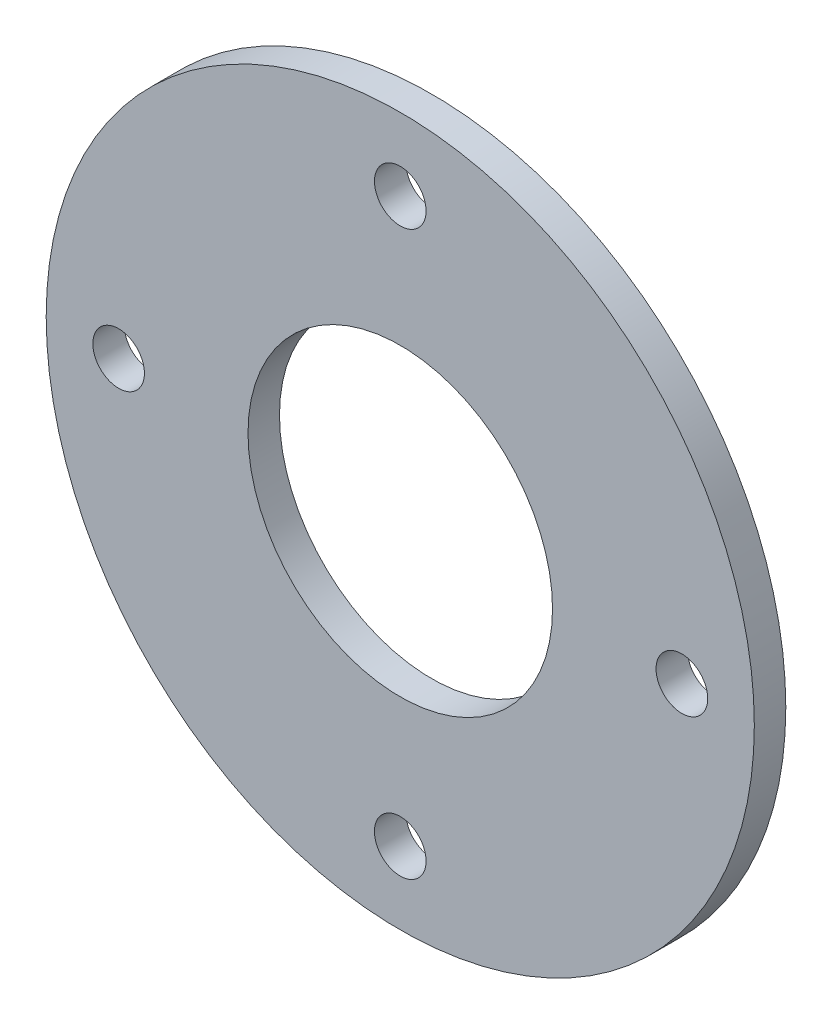
ISO-10303-21;
HEADER;
FILE_DESCRIPTION(('STEP AP214'),'2;1');
FILE_NAME('part.step','',(''),(''),'','','');
FILE_SCHEMA(('AUTOMOTIVE_DESIGN { 1 0 10303 214 1 1 1 1 }'));
ENDSEC;
DATA;
#1=APPLICATION_CONTEXT('core data for automotive mechanical design processes');
#2=APPLICATION_PROTOCOL_DEFINITION('international standard','automotive_design',2000,#1);
#3=PRODUCT_CONTEXT('',#1,'mechanical');
#4=PRODUCT('Part','Part','',(#3));
#5=PRODUCT_RELATED_PRODUCT_CATEGORY('part','',(#4));
#6=PRODUCT_DEFINITION_FORMATION('','',#4);
#7=PRODUCT_DEFINITION_CONTEXT('part definition',#1,'design');
#8=PRODUCT_DEFINITION('design','',#6,#7);
#9=PRODUCT_DEFINITION_SHAPE('','',#8);
#10=(LENGTH_UNIT() NAMED_UNIT(*) SI_UNIT(.MILLI.,.METRE.));
#11=(NAMED_UNIT(*) PLANE_ANGLE_UNIT() SI_UNIT($,.RADIAN.));
#12=(NAMED_UNIT(*) SI_UNIT($,.STERADIAN.) SOLID_ANGLE_UNIT());
#13=UNCERTAINTY_MEASURE_WITH_UNIT(LENGTH_MEASURE(1.E-05),#10,'distance_accuracy_value','');
#14=(GEOMETRIC_REPRESENTATION_CONTEXT(3) GLOBAL_UNCERTAINTY_ASSIGNED_CONTEXT((#13)) GLOBAL_UNIT_ASSIGNED_CONTEXT((#10,
#11,#12)) REPRESENTATION_CONTEXT('',''));
#15=CARTESIAN_POINT('',(0.,0.,0.));
#16=DIRECTION('',(0.,0.,1.));
#17=DIRECTION('',(1.,0.,0.));
#18=AXIS2_PLACEMENT_3D('',#15,#16,#17);
#19=CARTESIAN_POINT('',(0.,0.,0.));
#20=DIRECTION('',(0.,0.,1.));
#21=DIRECTION('',(1.,0.,0.));
#22=AXIS2_PLACEMENT_3D('',#19,#20,#21);
#23=PLANE('',#22);
#24=CARTESIAN_POINT('',(-90.9113801471292,0.,0.));
#25=DIRECTION('',(0.,0.,-1.));
#26=DIRECTION('',(-1.,0.,0.));
#27=AXIS2_PLACEMENT_3D('',#24,#25,#26);
#28=CIRCLE('',#27,8.33373999999999);
#29=CARTESIAN_POINT('',(-99.2451201471292,0.,0.));
#30=VERTEX_POINT('',#29);
#31=EDGE_CURVE('E67',#30,#30,#28,.T.);
#32=ORIENTED_EDGE('',*,*,#31,.F.);
#33=EDGE_LOOP('',(#32));
#34=FACE_BOUND('',#33,.T.);
#35=CARTESIAN_POINT('',(0.,-90.9113801471292,0.));
#36=DIRECTION('',(0.,0.,-1.));
#37=DIRECTION('',(-1.,0.,0.));
#38=AXIS2_PLACEMENT_3D('',#35,#36,#37);
#39=CIRCLE('',#38,8.33373999999999);
#40=CARTESIAN_POINT('',(-8.33373999999999,-90.9113801471292,0.));
#41=VERTEX_POINT('',#40);
#42=EDGE_CURVE('E61',#41,#41,#39,.T.);
#43=ORIENTED_EDGE('',*,*,#42,.F.);
#44=EDGE_LOOP('',(#43));
#45=FACE_BOUND('',#44,.T.);
#46=CARTESIAN_POINT('',(90.9113801471292,0.,0.));
#47=DIRECTION('',(0.,0.,-1.));
#48=DIRECTION('',(-1.,0.,0.));
#49=AXIS2_PLACEMENT_3D('',#46,#47,#48);
#50=CIRCLE('',#49,8.33373999999999);
#51=CARTESIAN_POINT('',(82.5776401471292,0.,0.));
#52=VERTEX_POINT('',#51);
#53=EDGE_CURVE('E53',#52,#52,#50,.T.);
#54=ORIENTED_EDGE('',*,*,#53,.F.);
#55=EDGE_LOOP('',(#54));
#56=FACE_BOUND('',#55,.T.);
#57=CARTESIAN_POINT('',(0.,0.,0.));
#58=DIRECTION('',(0.,0.,1.));
#59=DIRECTION('',(1.,0.,0.));
#60=AXIS2_PLACEMENT_3D('',#57,#58,#59);
#61=CIRCLE('',#60,114.3);
#62=CARTESIAN_POINT('',(114.3,0.,0.));
#63=VERTEX_POINT('',#62);
#64=EDGE_CURVE('E41',#63,#63,#61,.T.);
#65=ORIENTED_EDGE('',*,*,#64,.F.);
#66=EDGE_LOOP('',(#65));
#67=FACE_BOUND('',#66,.T.);
#68=CARTESIAN_POINT('',(0.,0.,0.));
#69=DIRECTION('',(0.,0.,1.));
#70=DIRECTION('',(1.,0.,0.));
#71=AXIS2_PLACEMENT_3D('',#68,#69,#70);
#72=CIRCLE('',#71,49.1499994635115);
#73=CARTESIAN_POINT('',(49.1499994635115,0.,0.));
#74=VERTEX_POINT('',#73);
#75=EDGE_CURVE('E50',#74,#74,#72,.T.);
#76=ORIENTED_EDGE('',*,*,#75,.T.);
#77=EDGE_LOOP('',(#76));
#78=FACE_BOUND('',#77,.T.);
#79=CARTESIAN_POINT('',(0.,90.8527596999048,0.));
#80=DIRECTION('',(0.,0.,-1.));
#81=DIRECTION('',(-1.,0.,0.));
#82=AXIS2_PLACEMENT_3D('',#79,#80,#81);
#83=CIRCLE('',#82,8.33373999999999);
#84=CARTESIAN_POINT('',(-8.33373999999999,90.8527596999048,0.));
#85=VERTEX_POINT('',#84);
#86=EDGE_CURVE('E73',#85,#85,#83,.T.);
#87=ORIENTED_EDGE('',*,*,#86,.F.);
#88=EDGE_LOOP('',(#87));
#89=FACE_BOUND('',#88,.T.);
#90=ADVANCED_FACE('F37',(#34,#45,#56,#67,#78,#89),#23,.F.);
#91=CARTESIAN_POINT('',(0.,0.,10.16));
#92=DIRECTION('',(0.,0.,1.));
#93=DIRECTION('',(1.,0.,0.));
#94=AXIS2_PLACEMENT_3D('',#91,#92,#93);
#95=PLANE('',#94);
#96=CARTESIAN_POINT('',(0.,90.8527596999048,10.16));
#97=DIRECTION('',(0.,0.,-1.));
#98=DIRECTION('',(-1.,0.,0.));
#99=AXIS2_PLACEMENT_3D('',#96,#97,#98);
#100=CIRCLE('',#99,8.33373999999998);
#101=CARTESIAN_POINT('',(-8.33373999999998,90.8527596999048,10.16));
#102=VERTEX_POINT('',#101);
#103=EDGE_CURVE('E76',#102,#102,#100,.T.);
#104=ORIENTED_EDGE('',*,*,#103,.T.);
#105=EDGE_LOOP('',(#104));
#106=FACE_BOUND('',#105,.T.);
#107=CARTESIAN_POINT('',(-90.9113801471292,0.,10.16));
#108=DIRECTION('',(0.,0.,-1.));
#109=DIRECTION('',(-1.,0.,0.));
#110=AXIS2_PLACEMENT_3D('',#107,#108,#109);
#111=CIRCLE('',#110,8.33373999999999);
#112=CARTESIAN_POINT('',(-99.2451201471292,0.,10.16));
#113=VERTEX_POINT('',#112);
#114=EDGE_CURVE('E70',#113,#113,#111,.T.);
#115=ORIENTED_EDGE('',*,*,#114,.T.);
#116=EDGE_LOOP('',(#115));
#117=FACE_BOUND('',#116,.T.);
#118=CARTESIAN_POINT('',(0.,-90.9113801471292,10.16));
#119=DIRECTION('',(0.,0.,-1.));
#120=DIRECTION('',(-1.,0.,0.));
#121=AXIS2_PLACEMENT_3D('',#118,#119,#120);
#122=CIRCLE('',#121,8.33373999999998);
#123=CARTESIAN_POINT('',(-8.33373999999998,-90.9113801471292,10.16));
#124=VERTEX_POINT('',#123);
#125=EDGE_CURVE('E64',#124,#124,#122,.T.);
#126=ORIENTED_EDGE('',*,*,#125,.T.);
#127=EDGE_LOOP('',(#126));
#128=FACE_BOUND('',#127,.T.);
#129=CARTESIAN_POINT('',(90.9113801471292,0.,10.16));
#130=DIRECTION('',(0.,0.,-1.));
#131=DIRECTION('',(-1.,0.,0.));
#132=AXIS2_PLACEMENT_3D('',#129,#130,#131);
#133=CIRCLE('',#132,8.33373999999998);
#134=CARTESIAN_POINT('',(82.5776401471292,0.,10.16));
#135=VERTEX_POINT('',#134);
#136=EDGE_CURVE('E58',#135,#135,#133,.T.);
#137=ORIENTED_EDGE('',*,*,#136,.T.);
#138=EDGE_LOOP('',(#137));
#139=FACE_BOUND('',#138,.T.);
#140=CARTESIAN_POINT('',(0.,0.,10.16));
#141=DIRECTION('',(0.,0.,1.));
#142=DIRECTION('',(1.,0.,0.));
#143=AXIS2_PLACEMENT_3D('',#140,#141,#142);
#144=CIRCLE('',#143,114.3);
#145=CARTESIAN_POINT('',(114.3,0.,10.16));
#146=VERTEX_POINT('',#145);
#147=EDGE_CURVE('E10',#146,#146,#144,.T.);
#148=ORIENTED_EDGE('',*,*,#147,.T.);
#149=EDGE_LOOP('',(#148));
#150=FACE_BOUND('',#149,.T.);
#151=CARTESIAN_POINT('',(0.,0.,10.16));
#152=DIRECTION('',(0.,0.,1.));
#153=DIRECTION('',(1.,0.,0.));
#154=AXIS2_PLACEMENT_3D('',#151,#152,#153);
#155=CIRCLE('',#154,49.1499994635115);
#156=CARTESIAN_POINT('',(49.1499994635115,0.,10.16));
#157=VERTEX_POINT('',#156);
#158=EDGE_CURVE('E48',#157,#157,#155,.T.);
#159=ORIENTED_EDGE('',*,*,#158,.F.);
#160=EDGE_LOOP('',(#159));
#161=FACE_BOUND('',#160,.T.);
#162=ADVANCED_FACE('F80',(#106,#117,#128,#139,#150,#161),#95,.T.);
#163=CARTESIAN_POINT('',(0.,0.,10.16));
#164=DIRECTION('',(0.,0.,-1.));
#165=DIRECTION('',(-1.,0.,0.));
#166=AXIS2_PLACEMENT_3D('',#163,#164,#165);
#167=CYLINDRICAL_SURFACE('',#166,114.3);
#168=ORIENTED_EDGE('',*,*,#147,.F.);
#169=EDGE_LOOP('',(#168));
#170=FACE_BOUND('',#169,.T.);
#171=ORIENTED_EDGE('',*,*,#64,.T.);
#172=EDGE_LOOP('',(#171));
#173=FACE_BOUND('',#172,.T.);
#174=ADVANCED_FACE('F39',(#170,#173),#167,.T.);
#175=CARTESIAN_POINT('',(0.,0.,10.16));
#176=DIRECTION('',(0.,0.,-1.));
#177=DIRECTION('',(-1.,0.,0.));
#178=AXIS2_PLACEMENT_3D('',#175,#176,#177);
#179=CYLINDRICAL_SURFACE('',#178,49.1499994635115);
#180=ORIENTED_EDGE('',*,*,#158,.T.);
#181=EDGE_LOOP('',(#180));
#182=FACE_BOUND('',#181,.T.);
#183=ORIENTED_EDGE('',*,*,#75,.F.);
#184=EDGE_LOOP('',(#183));
#185=FACE_BOUND('',#184,.T.);
#186=ADVANCED_FACE('F99',(#182,#185),#179,.F.);
#187=CARTESIAN_POINT('',(90.9113801471292,0.,0.));
#188=DIRECTION('',(0.,0.,-1.));
#189=DIRECTION('',(-1.,0.,0.));
#190=AXIS2_PLACEMENT_3D('',#187,#188,#189);
#191=CYLINDRICAL_SURFACE('',#190,8.33373999999998);
#192=ORIENTED_EDGE('',*,*,#136,.F.);
#193=EDGE_LOOP('',(#192));
#194=FACE_BOUND('',#193,.T.);
#195=ORIENTED_EDGE('',*,*,#53,.T.);
#196=EDGE_LOOP('',(#195));
#197=FACE_BOUND('',#196,.T.);
#198=ADVANCED_FACE('F102',(#194,#197),#191,.F.);
#199=CARTESIAN_POINT('',(0.,-90.9113801471292,0.));
#200=DIRECTION('',(0.,0.,-1.));
#201=DIRECTION('',(-1.,0.,0.));
#202=AXIS2_PLACEMENT_3D('',#199,#200,#201);
#203=CYLINDRICAL_SURFACE('',#202,8.33373999999998);
#204=ORIENTED_EDGE('',*,*,#125,.F.);
#205=EDGE_LOOP('',(#204));
#206=FACE_BOUND('',#205,.T.);
#207=ORIENTED_EDGE('',*,*,#42,.T.);
#208=EDGE_LOOP('',(#207));
#209=FACE_BOUND('',#208,.T.);
#210=ADVANCED_FACE('F106',(#206,#209),#203,.F.);
#211=CARTESIAN_POINT('',(-90.9113801471292,0.,0.));
#212=DIRECTION('',(0.,0.,-1.));
#213=DIRECTION('',(-1.,0.,0.));
#214=AXIS2_PLACEMENT_3D('',#211,#212,#213);
#215=CYLINDRICAL_SURFACE('',#214,8.33373999999999);
#216=ORIENTED_EDGE('',*,*,#114,.F.);
#217=EDGE_LOOP('',(#216));
#218=FACE_BOUND('',#217,.T.);
#219=ORIENTED_EDGE('',*,*,#31,.T.);
#220=EDGE_LOOP('',(#219));
#221=FACE_BOUND('',#220,.T.);
#222=ADVANCED_FACE('F86',(#218,#221),#215,.F.);
#223=CARTESIAN_POINT('',(0.,90.8527596999048,0.));
#224=DIRECTION('',(0.,0.,-1.));
#225=DIRECTION('',(-1.,0.,0.));
#226=AXIS2_PLACEMENT_3D('',#223,#224,#225);
#227=CYLINDRICAL_SURFACE('',#226,8.33373999999998);
#228=ORIENTED_EDGE('',*,*,#103,.F.);
#229=EDGE_LOOP('',(#228));
#230=FACE_BOUND('',#229,.T.);
#231=ORIENTED_EDGE('',*,*,#86,.T.);
#232=EDGE_LOOP('',(#231));
#233=FACE_BOUND('',#232,.T.);
#234=ADVANCED_FACE('F83',(#230,#233),#227,.F.);
#235=CLOSED_SHELL('',(#90,#162,#174,#186,#198,#210,#222,#234));
#236=MANIFOLD_SOLID_BREP('B2',#235);
#237=ADVANCED_BREP_SHAPE_REPRESENTATION('',(#18,#236),#14);
#238=SHAPE_DEFINITION_REPRESENTATION(#9,#237);
ENDSEC;
END-ISO-10303-21;
